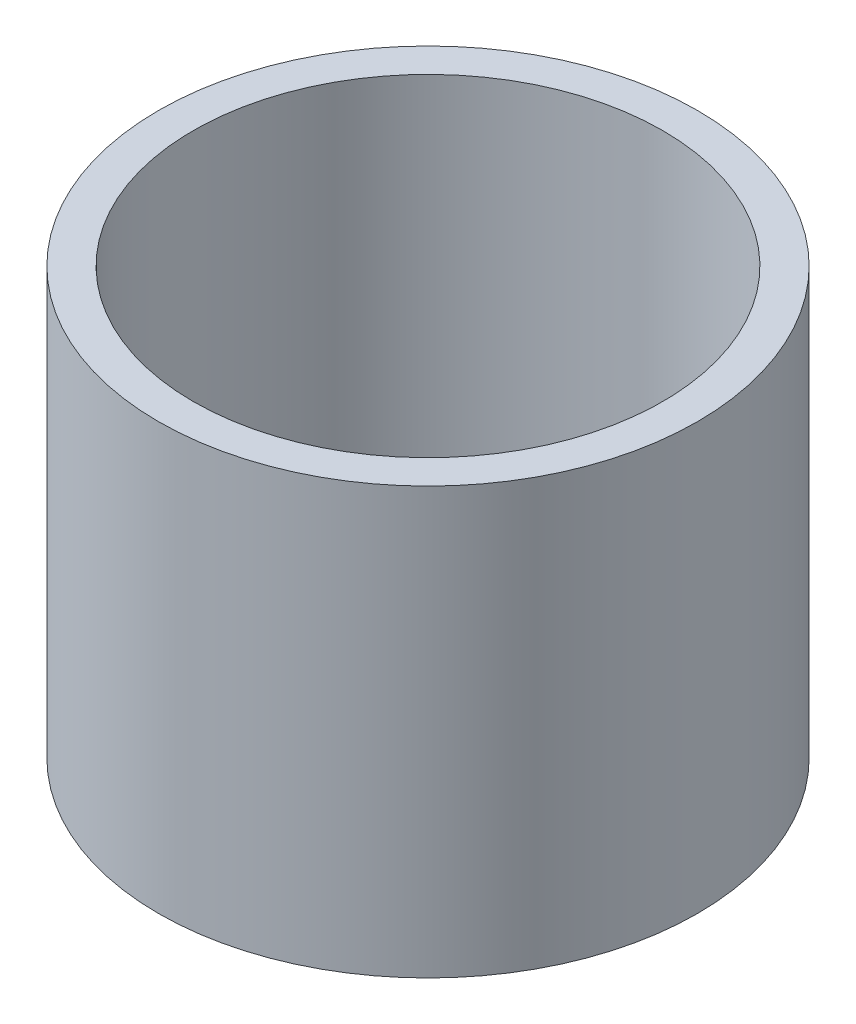
ISO-10303-21;
HEADER;
FILE_DESCRIPTION(('STEP AP214'),'2;1');
FILE_NAME('part.step','',(''),(''),'','','');
FILE_SCHEMA(('AUTOMOTIVE_DESIGN { 1 0 10303 214 1 1 1 1 }'));
ENDSEC;
DATA;
#1=APPLICATION_CONTEXT('core data for automotive mechanical design processes');
#2=APPLICATION_PROTOCOL_DEFINITION('international standard','automotive_design',2000,#1);
#3=PRODUCT_CONTEXT('',#1,'mechanical');
#4=PRODUCT('Part','Part','',(#3));
#5=PRODUCT_RELATED_PRODUCT_CATEGORY('part','',(#4));
#6=PRODUCT_DEFINITION_FORMATION('','',#4);
#7=PRODUCT_DEFINITION_CONTEXT('part definition',#1,'design');
#8=PRODUCT_DEFINITION('design','',#6,#7);
#9=PRODUCT_DEFINITION_SHAPE('','',#8);
#10=(LENGTH_UNIT() NAMED_UNIT(*) SI_UNIT(.MILLI.,.METRE.));
#11=(NAMED_UNIT(*) PLANE_ANGLE_UNIT() SI_UNIT($,.RADIAN.));
#12=(NAMED_UNIT(*) SI_UNIT($,.STERADIAN.) SOLID_ANGLE_UNIT());
#13=UNCERTAINTY_MEASURE_WITH_UNIT(LENGTH_MEASURE(1.E-05),#10,'distance_accuracy_value','');
#14=(GEOMETRIC_REPRESENTATION_CONTEXT(3) GLOBAL_UNCERTAINTY_ASSIGNED_CONTEXT((#13)) GLOBAL_UNIT_ASSIGNED_CONTEXT((#10,
#11,#12)) REPRESENTATION_CONTEXT('',''));
#15=CARTESIAN_POINT('',(0.,0.,0.));
#16=DIRECTION('',(0.,0.,1.));
#17=DIRECTION('',(1.,0.,0.));
#18=AXIS2_PLACEMENT_3D('',#15,#16,#17);
#19=CARTESIAN_POINT('',(0.,245.,0.));
#20=DIRECTION('',(0.,1.,0.));
#21=DIRECTION('',(0.,0.,1.));
#22=AXIS2_PLACEMENT_3D('',#19,#20,#21);
#23=PLANE('',#22);
#24=CARTESIAN_POINT('',(0.,245.,0.));
#25=DIRECTION('',(0.,1.,0.));
#26=DIRECTION('',(0.,0.,1.));
#27=AXIS2_PLACEMENT_3D('',#24,#25,#26);
#28=CIRCLE('',#27,155.);
#29=CARTESIAN_POINT('',(0.,245.,155.));
#30=VERTEX_POINT('',#29);
#31=EDGE_CURVE('E10',#30,#30,#28,.T.);
#32=ORIENTED_EDGE('',*,*,#31,.T.);
#33=EDGE_LOOP('',(#32));
#34=FACE_BOUND('',#33,.T.);
#35=CARTESIAN_POINT('',(0.,245.,0.));
#36=DIRECTION('',(0.,1.,0.));
#37=DIRECTION('',(0.,0.,1.));
#38=AXIS2_PLACEMENT_3D('',#35,#36,#37);
#39=CIRCLE('',#38,135.);
#40=CARTESIAN_POINT('',(0.,245.,135.));
#41=VERTEX_POINT('',#40);
#42=EDGE_CURVE('E52',#41,#41,#39,.T.);
#43=ORIENTED_EDGE('',*,*,#42,.F.);
#44=EDGE_LOOP('',(#43));
#45=FACE_BOUND('',#44,.T.);
#46=ADVANCED_FACE('F39',(#34,#45),#23,.T.);
#47=CARTESIAN_POINT('',(0.,0.,0.));
#48=DIRECTION('',(0.,1.,0.));
#49=DIRECTION('',(0.,0.,1.));
#50=AXIS2_PLACEMENT_3D('',#47,#48,#49);
#51=PLANE('',#50);
#52=CARTESIAN_POINT('',(0.,0.,0.));
#53=DIRECTION('',(0.,1.,0.));
#54=DIRECTION('',(0.,0.,1.));
#55=AXIS2_PLACEMENT_3D('',#52,#53,#54);
#56=CIRCLE('',#55,155.);
#57=CARTESIAN_POINT('',(0.,0.,155.));
#58=VERTEX_POINT('',#57);
#59=EDGE_CURVE('E43',#58,#58,#56,.T.);
#60=ORIENTED_EDGE('',*,*,#59,.F.);
#61=EDGE_LOOP('',(#60));
#62=FACE_BOUND('',#61,.T.);
#63=CARTESIAN_POINT('',(0.,0.,0.));
#64=DIRECTION('',(0.,1.,0.));
#65=DIRECTION('',(0.,0.,1.));
#66=AXIS2_PLACEMENT_3D('',#63,#64,#65);
#67=CIRCLE('',#66,135.);
#68=CARTESIAN_POINT('',(0.,0.,135.));
#69=VERTEX_POINT('',#68);
#70=EDGE_CURVE('E54',#69,#69,#67,.T.);
#71=ORIENTED_EDGE('',*,*,#70,.T.);
#72=EDGE_LOOP('',(#71));
#73=FACE_BOUND('',#72,.T.);
#74=ADVANCED_FACE('F66',(#62,#73),#51,.F.);
#75=CARTESIAN_POINT('',(0.,245.,0.));
#76=DIRECTION('',(0.,-1.,0.));
#77=DIRECTION('',(0.,0.,-1.));
#78=AXIS2_PLACEMENT_3D('',#75,#76,#77);
#79=CYLINDRICAL_SURFACE('',#78,155.);
#80=ORIENTED_EDGE('',*,*,#31,.F.);
#81=EDGE_LOOP('',(#80));
#82=FACE_BOUND('',#81,.T.);
#83=ORIENTED_EDGE('',*,*,#59,.T.);
#84=EDGE_LOOP('',(#83));
#85=FACE_BOUND('',#84,.T.);
#86=ADVANCED_FACE('F41',(#82,#85),#79,.T.);
#87=CARTESIAN_POINT('',(0.,245.,0.));
#88=DIRECTION('',(0.,-1.,0.));
#89=DIRECTION('',(0.,0.,-1.));
#90=AXIS2_PLACEMENT_3D('',#87,#88,#89);
#91=CYLINDRICAL_SURFACE('',#90,135.);
#92=ORIENTED_EDGE('',*,*,#42,.T.);
#93=EDGE_LOOP('',(#92));
#94=FACE_BOUND('',#93,.T.);
#95=ORIENTED_EDGE('',*,*,#70,.F.);
#96=EDGE_LOOP('',(#95));
#97=FACE_BOUND('',#96,.T.);
#98=ADVANCED_FACE('F62',(#94,#97),#91,.F.);
#99=CLOSED_SHELL('',(#46,#74,#86,#98));
#100=MANIFOLD_SOLID_BREP('B2',#99);
#101=ADVANCED_BREP_SHAPE_REPRESENTATION('',(#18,#100),#14);
#102=SHAPE_DEFINITION_REPRESENTATION(#9,#101);
ENDSEC;
END-ISO-10303-21;
